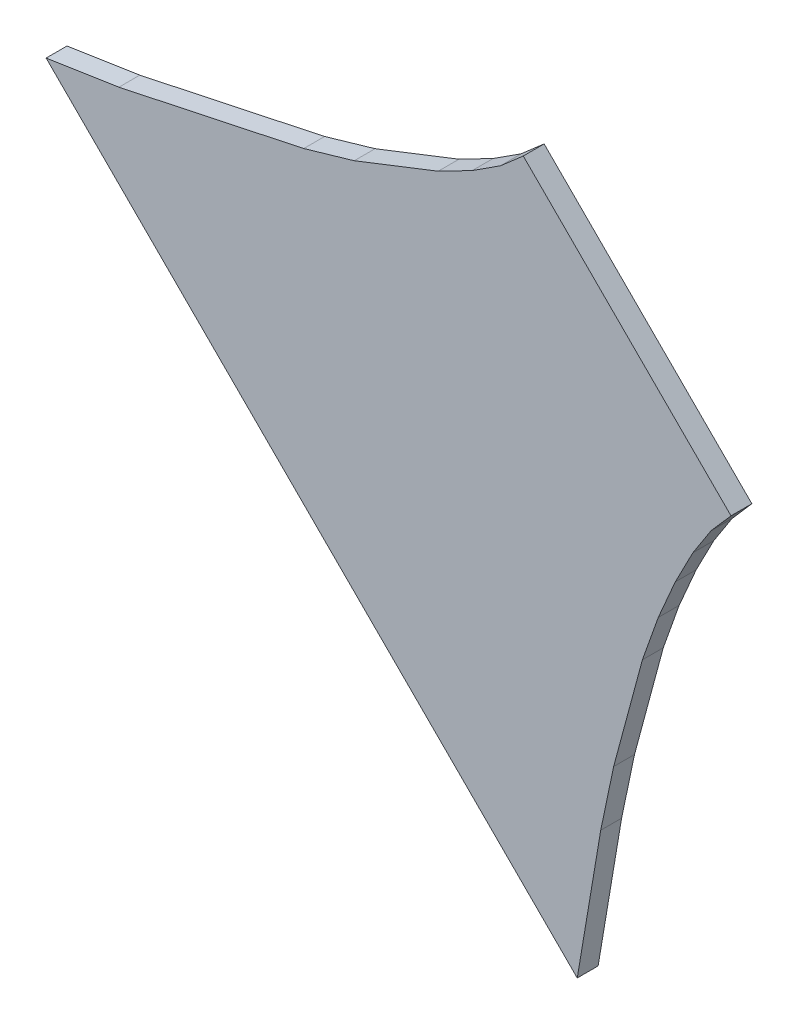
ISO-10303-21;
HEADER;
FILE_DESCRIPTION(('STEP AP214'),'2;1');
FILE_NAME('part.step','',(''),(''),'','','');
FILE_SCHEMA(('AUTOMOTIVE_DESIGN { 1 0 10303 214 1 1 1 1 }'));
ENDSEC;
DATA;
#1=APPLICATION_CONTEXT('core data for automotive mechanical design processes');
#2=APPLICATION_PROTOCOL_DEFINITION('international standard','automotive_design',2000,#1);
#3=PRODUCT_CONTEXT('',#1,'mechanical');
#4=PRODUCT('Part','Part','',(#3));
#5=PRODUCT_RELATED_PRODUCT_CATEGORY('part','',(#4));
#6=PRODUCT_DEFINITION_FORMATION('','',#4);
#7=PRODUCT_DEFINITION_CONTEXT('part definition',#1,'design');
#8=PRODUCT_DEFINITION('design','',#6,#7);
#9=PRODUCT_DEFINITION_SHAPE('','',#8);
#10=(LENGTH_UNIT() NAMED_UNIT(*) SI_UNIT(.MILLI.,.METRE.));
#11=(NAMED_UNIT(*) PLANE_ANGLE_UNIT() SI_UNIT($,.RADIAN.));
#12=(NAMED_UNIT(*) SI_UNIT($,.STERADIAN.) SOLID_ANGLE_UNIT());
#13=UNCERTAINTY_MEASURE_WITH_UNIT(LENGTH_MEASURE(1.E-05),#10,'distance_accuracy_value','');
#14=(GEOMETRIC_REPRESENTATION_CONTEXT(3) GLOBAL_UNCERTAINTY_ASSIGNED_CONTEXT((#13)) GLOBAL_UNIT_ASSIGNED_CONTEXT((#10,
#11,#12)) REPRESENTATION_CONTEXT('',''));
#15=CARTESIAN_POINT('',(0.,0.,0.));
#16=DIRECTION('',(0.,0.,1.));
#17=DIRECTION('',(1.,0.,0.));
#18=AXIS2_PLACEMENT_3D('',#15,#16,#17);
#19=CARTESIAN_POINT('',(111.180000305176,114.353996276855,0.));
#20=DIRECTION('',(0.657083640077483,-0.753817676857292,0.));
#21=DIRECTION('',(-0.753817676857292,-0.657083640077483,0.));
#22=AXIS2_PLACEMENT_3D('',#19,#20,#21);
#23=PLANE('',#22);
#24=DIRECTION('',(-0.753817676857292,-0.657083640077483,0.));
#25=VECTOR('',#24,1.);
#26=CARTESIAN_POINT('',(111.180000305176,114.353996276855,0.03556));
#27=LINE('',#26,#25);
#28=CARTESIAN_POINT('',(111.180000305176,114.353996276855,0.03556));
#29=VERTEX_POINT('',#28);
#30=CARTESIAN_POINT('',(111.140998840332,114.319999694824,0.03556));
#31=VERTEX_POINT('',#30);
#32=EDGE_CURVE('E11',#29,#31,#27,.T.);
#33=ORIENTED_EDGE('',*,*,#32,.F.);
#34=DIRECTION('',(0.,0.,1.));
#35=VECTOR('',#34,1.);
#36=CARTESIAN_POINT('',(111.180000305176,114.353996276855,0.));
#37=LINE('',#36,#35);
#38=CARTESIAN_POINT('',(111.180000305176,114.353996276855,0.));
#39=VERTEX_POINT('',#38);
#40=EDGE_CURVE('E24',#39,#29,#37,.T.);
#41=ORIENTED_EDGE('',*,*,#40,.F.);
#42=DIRECTION('',(-0.753817676857292,-0.657083640077483,0.));
#43=VECTOR('',#42,1.);
#44=CARTESIAN_POINT('',(111.180000305176,114.353996276855,0.));
#45=LINE('',#44,#43);
#46=CARTESIAN_POINT('',(111.140998840332,114.319999694824,0.));
#47=VERTEX_POINT('',#46);
#48=EDGE_CURVE('E154',#39,#47,#45,.T.);
#49=ORIENTED_EDGE('',*,*,#48,.T.);
#50=DIRECTION('',(0.,0.,1.));
#51=VECTOR('',#50,1.);
#52=CARTESIAN_POINT('',(111.140998840332,114.319999694824,0.));
#53=LINE('',#52,#51);
#54=EDGE_CURVE('E37',#47,#31,#53,.T.);
#55=ORIENTED_EDGE('',*,*,#54,.T.);
#56=EDGE_LOOP('',(#33,#41,#49,#55));
#57=FACE_BOUND('',#56,.T.);
#58=ADVANCED_FACE('F17',(#57),#23,.F.);
#59=CARTESIAN_POINT('',(111.140998840332,114.319999694824,0.));
#60=DIRECTION('',(0.54253132067584,-0.840035574297737,0.));
#61=DIRECTION('',(-0.840035574297737,-0.54253132067584,0.));
#62=AXIS2_PLACEMENT_3D('',#59,#60,#61);
#63=PLANE('',#62);
#64=DIRECTION('',(-0.840035574297737,-0.54253132067584,0.));
#65=VECTOR('',#64,1.);
#66=CARTESIAN_POINT('',(111.140998840332,114.319999694824,0.03556));
#67=LINE('',#66,#65);
#68=CARTESIAN_POINT('',(111.093002319336,114.289001464844,0.03556));
#69=VERTEX_POINT('',#68);
#70=EDGE_CURVE('E266',#31,#69,#67,.T.);
#71=ORIENTED_EDGE('',*,*,#70,.F.);
#72=ORIENTED_EDGE('',*,*,#54,.F.);
#73=DIRECTION('',(-0.840035574297737,-0.54253132067584,0.));
#74=VECTOR('',#73,1.);
#75=CARTESIAN_POINT('',(111.140998840332,114.319999694824,0.));
#76=LINE('',#75,#74);
#77=CARTESIAN_POINT('',(111.093002319336,114.289001464844,0.));
#78=VERTEX_POINT('',#77);
#79=EDGE_CURVE('E263',#47,#78,#76,.T.);
#80=ORIENTED_EDGE('',*,*,#79,.T.);
#81=DIRECTION('',(0.,0.,1.));
#82=VECTOR('',#81,1.);
#83=CARTESIAN_POINT('',(111.093002319336,114.289001464844,0.));
#84=LINE('',#83,#82);
#85=EDGE_CURVE('E261',#78,#69,#84,.T.);
#86=ORIENTED_EDGE('',*,*,#85,.T.);
#87=EDGE_LOOP('',(#71,#72,#80,#86));
#88=FACE_BOUND('',#87,.T.);
#89=ADVANCED_FACE('F274',(#88),#63,.F.);
#90=CARTESIAN_POINT('',(111.093002319336,114.289001464844,0.));
#91=DIRECTION('',(0.459416561690511,-0.888220931325348,0.));
#92=DIRECTION('',(-0.888220931325348,-0.459416561690511,0.));
#93=AXIS2_PLACEMENT_3D('',#90,#91,#92);
#94=PLANE('',#93);
#95=DIRECTION('',(-0.888220931325348,-0.459416561690511,0.));
#96=VECTOR('',#95,1.);
#97=CARTESIAN_POINT('',(111.093002319336,114.289001464844,0.03556));
#98=LINE('',#97,#96);
#99=CARTESIAN_POINT('',(111.035003662109,114.259002685547,0.03556));
#100=VERTEX_POINT('',#99);
#101=EDGE_CURVE('E258',#69,#100,#98,.T.);
#102=ORIENTED_EDGE('',*,*,#101,.F.);
#103=ORIENTED_EDGE('',*,*,#85,.F.);
#104=DIRECTION('',(-0.888220931325348,-0.459416561690511,0.));
#105=VECTOR('',#104,1.);
#106=CARTESIAN_POINT('',(111.093002319336,114.289001464844,0.));
#107=LINE('',#106,#105);
#108=CARTESIAN_POINT('',(111.035003662109,114.259002685547,0.));
#109=VERTEX_POINT('',#108);
#110=EDGE_CURVE('E255',#78,#109,#107,.T.);
#111=ORIENTED_EDGE('',*,*,#110,.T.);
#112=DIRECTION('',(0.,0.,1.));
#113=VECTOR('',#112,1.);
#114=CARTESIAN_POINT('',(111.035003662109,114.259002685547,0.));
#115=LINE('',#114,#113);
#116=EDGE_CURVE('E253',#109,#100,#115,.T.);
#117=ORIENTED_EDGE('',*,*,#116,.T.);
#118=EDGE_LOOP('',(#102,#103,#111,#117));
#119=FACE_BOUND('',#118,.T.);
#120=ADVANCED_FACE('F280',(#119),#94,.F.);
#121=CARTESIAN_POINT('',(111.035003662109,114.259002685547,0.));
#122=DIRECTION('',(0.364631599122009,-0.9311518656598,0.));
#123=DIRECTION('',(-0.9311518656598,-0.364631599122009,0.));
#124=AXIS2_PLACEMENT_3D('',#121,#122,#123);
#125=PLANE('',#124);
#126=DIRECTION('',(-0.9311518656598,-0.364631599122009,0.));
#127=VECTOR('',#126,1.);
#128=CARTESIAN_POINT('',(111.035003662109,114.259002685547,0.03556));
#129=LINE('',#128,#127);
#130=CARTESIAN_POINT('',(110.891998291016,114.203002929688,0.03556));
#131=VERTEX_POINT('',#130);
#132=EDGE_CURVE('E250',#100,#131,#129,.T.);
#133=ORIENTED_EDGE('',*,*,#132,.F.);
#134=ORIENTED_EDGE('',*,*,#116,.F.);
#135=DIRECTION('',(-0.9311518656598,-0.364631599122009,0.));
#136=VECTOR('',#135,1.);
#137=CARTESIAN_POINT('',(111.035003662109,114.259002685547,0.));
#138=LINE('',#137,#136);
#139=CARTESIAN_POINT('',(110.891998291016,114.203002929688,0.));
#140=VERTEX_POINT('',#139);
#141=EDGE_CURVE('E247',#109,#140,#138,.T.);
#142=ORIENTED_EDGE('',*,*,#141,.T.);
#143=DIRECTION('',(0.,0.,1.));
#144=VECTOR('',#143,1.);
#145=CARTESIAN_POINT('',(110.891998291016,114.203002929688,0.));
#146=LINE('',#145,#144);
#147=EDGE_CURVE('E245',#140,#131,#146,.T.);
#148=ORIENTED_EDGE('',*,*,#147,.T.);
#149=EDGE_LOOP('',(#133,#134,#142,#148));
#150=FACE_BOUND('',#149,.T.);
#151=ADVANCED_FACE('F282',(#150),#125,.F.);
#152=CARTESIAN_POINT('',(110.891998291016,114.203002929688,0.));
#153=DIRECTION('',(0.279162457207201,-0.960243886981863,0.));
#154=DIRECTION('',(-0.960243886981863,-0.279162457207201,0.));
#155=AXIS2_PLACEMENT_3D('',#152,#153,#154);
#156=PLANE('',#155);
#157=DIRECTION('',(-0.960243886981863,-0.279162457207201,0.));
#158=VECTOR('',#157,1.);
#159=CARTESIAN_POINT('',(110.891998291016,114.203002929688,0.03556));
#160=LINE('',#159,#158);
#161=CARTESIAN_POINT('',(110.805999755859,114.178001403809,0.03556));
#162=VERTEX_POINT('',#161);
#163=EDGE_CURVE('E242',#131,#162,#160,.T.);
#164=ORIENTED_EDGE('',*,*,#163,.F.);
#165=ORIENTED_EDGE('',*,*,#147,.F.);
#166=DIRECTION('',(-0.960243886981863,-0.279162457207201,0.));
#167=VECTOR('',#166,1.);
#168=CARTESIAN_POINT('',(110.891998291016,114.203002929688,0.));
#169=LINE('',#168,#167);
#170=CARTESIAN_POINT('',(110.805999755859,114.178001403809,0.));
#171=VERTEX_POINT('',#170);
#172=EDGE_CURVE('E239',#140,#171,#169,.T.);
#173=ORIENTED_EDGE('',*,*,#172,.T.);
#174=DIRECTION('',(0.,0.,1.));
#175=VECTOR('',#174,1.);
#176=CARTESIAN_POINT('',(110.805999755859,114.178001403809,0.));
#177=LINE('',#176,#175);
#178=EDGE_CURVE('E237',#171,#162,#177,.T.);
#179=ORIENTED_EDGE('',*,*,#178,.T.);
#180=EDGE_LOOP('',(#164,#165,#173,#179));
#181=FACE_BOUND('',#180,.T.);
#182=ADVANCED_FACE('F287',(#181),#156,.F.);
#183=CARTESIAN_POINT('',(110.805999755859,114.178001403809,0.));
#184=DIRECTION('',(0.208046884834278,-0.97811885459322,0.));
#185=DIRECTION('',(-0.97811885459322,-0.208046884834278,0.));
#186=AXIS2_PLACEMENT_3D('',#183,#184,#185);
#187=PLANE('',#186);
#188=DIRECTION('',(-0.97811885459322,-0.208046884834278,0.));
#189=VECTOR('',#188,1.);
#190=CARTESIAN_POINT('',(110.805999755859,114.178001403809,0.03556));
#191=LINE('',#190,#189);
#192=CARTESIAN_POINT('',(110.490997314453,114.111000061035,0.03556));
#193=VERTEX_POINT('',#192);
#194=EDGE_CURVE('E234',#162,#193,#191,.T.);
#195=ORIENTED_EDGE('',*,*,#194,.F.);
#196=ORIENTED_EDGE('',*,*,#178,.F.);
#197=DIRECTION('',(-0.97811885459322,-0.208046884834278,0.));
#198=VECTOR('',#197,1.);
#199=CARTESIAN_POINT('',(110.805999755859,114.178001403809,0.));
#200=LINE('',#199,#198);
#201=CARTESIAN_POINT('',(110.490997314453,114.111000061035,0.));
#202=VERTEX_POINT('',#201);
#203=EDGE_CURVE('E231',#171,#202,#200,.T.);
#204=ORIENTED_EDGE('',*,*,#203,.T.);
#205=DIRECTION('',(0.,0.,1.));
#206=VECTOR('',#205,1.);
#207=CARTESIAN_POINT('',(110.490997314453,114.111000061035,0.));
#208=LINE('',#207,#206);
#209=EDGE_CURVE('E229',#202,#193,#208,.T.);
#210=ORIENTED_EDGE('',*,*,#209,.T.);
#211=EDGE_LOOP('',(#195,#196,#204,#210));
#212=FACE_BOUND('',#211,.T.);
#213=ADVANCED_FACE('F290',(#212),#187,.F.);
#214=CARTESIAN_POINT('',(110.490997314453,114.111000061035,0.));
#215=DIRECTION('',(0.151435620245677,-0.988467122832524,0.));
#216=DIRECTION('',(-0.988467122832524,-0.151435620245677,0.));
#217=AXIS2_PLACEMENT_3D('',#214,#215,#216);
#218=PLANE('',#217);
#219=DIRECTION('',(-0.988467122832524,-0.151435620245677,0.));
#220=VECTOR('',#219,1.);
#221=CARTESIAN_POINT('',(110.490997314453,114.111000061035,0.03556));
#222=LINE('',#221,#220);
#223=CARTESIAN_POINT('',(110.366996765137,114.092002868652,0.03556));
#224=VERTEX_POINT('',#223);
#225=EDGE_CURVE('E226',#193,#224,#222,.T.);
#226=ORIENTED_EDGE('',*,*,#225,.F.);
#227=ORIENTED_EDGE('',*,*,#209,.F.);
#228=DIRECTION('',(-0.988467122832524,-0.151435620245677,0.));
#229=VECTOR('',#228,1.);
#230=CARTESIAN_POINT('',(110.490997314453,114.111000061035,0.));
#231=LINE('',#230,#229);
#232=CARTESIAN_POINT('',(110.366996765137,114.092002868652,0.));
#233=VERTEX_POINT('',#232);
#234=EDGE_CURVE('E223',#202,#233,#231,.T.);
#235=ORIENTED_EDGE('',*,*,#234,.T.);
#236=DIRECTION('',(0.,0.,1.));
#237=VECTOR('',#236,1.);
#238=CARTESIAN_POINT('',(110.366996765137,114.092002868652,0.));
#239=LINE('',#238,#237);
#240=EDGE_CURVE('E221',#233,#224,#239,.T.);
#241=ORIENTED_EDGE('',*,*,#240,.T.);
#242=EDGE_LOOP('',(#226,#227,#235,#241));
#243=FACE_BOUND('',#242,.T.);
#244=ADVANCED_FACE('F295',(#243),#218,.F.);
#245=CARTESIAN_POINT('',(110.366996765137,114.092002868652,0.));
#246=DIRECTION('',(0.707106781186548,0.707106781186548,0.));
#247=DIRECTION('',(0.707106781186548,-0.707106781186548,0.));
#248=AXIS2_PLACEMENT_3D('',#245,#246,#247);
#249=PLANE('',#248);
#250=DIRECTION('',(0.707106781186548,-0.707106781186548,0.));
#251=VECTOR('',#250,1.);
#252=CARTESIAN_POINT('',(110.366996765137,114.092002868652,0.03556));
#253=LINE('',#252,#251);
#254=CARTESIAN_POINT('',(111.272003173828,113.186996459961,0.03556));
#255=VERTEX_POINT('',#254);
#256=EDGE_CURVE('E218',#224,#255,#253,.T.);
#257=ORIENTED_EDGE('',*,*,#256,.F.);
#258=ORIENTED_EDGE('',*,*,#240,.F.);
#259=DIRECTION('',(0.707106781186548,-0.707106781186548,0.));
#260=VECTOR('',#259,1.);
#261=CARTESIAN_POINT('',(110.366996765137,114.092002868652,0.));
#262=LINE('',#261,#260);
#263=CARTESIAN_POINT('',(111.272003173828,113.186996459961,0.));
#264=VERTEX_POINT('',#263);
#265=EDGE_CURVE('E215',#233,#264,#262,.T.);
#266=ORIENTED_EDGE('',*,*,#265,.T.);
#267=DIRECTION('',(0.,0.,1.));
#268=VECTOR('',#267,1.);
#269=CARTESIAN_POINT('',(111.272003173828,113.186996459961,0.));
#270=LINE('',#269,#268);
#271=EDGE_CURVE('E213',#264,#255,#270,.T.);
#272=ORIENTED_EDGE('',*,*,#271,.T.);
#273=EDGE_LOOP('',(#257,#258,#266,#272));
#274=FACE_BOUND('',#273,.T.);
#275=ADVANCED_FACE('F298',(#274),#249,.F.);
#276=CARTESIAN_POINT('',(111.272003173828,113.186996459961,0.));
#277=DIRECTION('',(-0.986174328564868,0.165711175482018,0.));
#278=DIRECTION('',(0.165711175482018,0.986174328564868,0.));
#279=AXIS2_PLACEMENT_3D('',#276,#277,#278);
#280=PLANE('',#279);
#281=DIRECTION('',(0.165711175482018,0.986174328564868,0.));
#282=VECTOR('',#281,1.);
#283=CARTESIAN_POINT('',(111.272003173828,113.186996459961,0.03556));
#284=LINE('',#283,#282);
#285=CARTESIAN_POINT('',(111.311996459961,113.425003051758,0.03556));
#286=VERTEX_POINT('',#285);
#287=EDGE_CURVE('E210',#255,#286,#284,.T.);
#288=ORIENTED_EDGE('',*,*,#287,.F.);
#289=ORIENTED_EDGE('',*,*,#271,.F.);
#290=DIRECTION('',(0.165711175482018,0.986174328564868,0.));
#291=VECTOR('',#290,1.);
#292=CARTESIAN_POINT('',(111.272003173828,113.186996459961,0.));
#293=LINE('',#292,#291);
#294=CARTESIAN_POINT('',(111.311996459961,113.425003051758,0.));
#295=VERTEX_POINT('',#294);
#296=EDGE_CURVE('E207',#264,#295,#293,.T.);
#297=ORIENTED_EDGE('',*,*,#296,.T.);
#298=DIRECTION('',(0.,0.,1.));
#299=VECTOR('',#298,1.);
#300=CARTESIAN_POINT('',(111.311996459961,113.425003051758,0.));
#301=LINE('',#300,#299);
#302=EDGE_CURVE('E205',#295,#286,#301,.T.);
#303=ORIENTED_EDGE('',*,*,#302,.T.);
#304=EDGE_LOOP('',(#288,#289,#297,#303));
#305=FACE_BOUND('',#304,.T.);
#306=ADVANCED_FACE('F303',(#305),#280,.F.);
#307=CARTESIAN_POINT('',(111.311996459961,113.425003051758,0.));
#308=DIRECTION('',(-0.978739521821311,0.205107163270794,0.));
#309=DIRECTION('',(0.205107163270794,0.978739521821311,0.));
#310=AXIS2_PLACEMENT_3D('',#307,#308,#309);
#311=PLANE('',#310);
#312=DIRECTION('',(0.205107163270794,0.978739521821311,0.));
#313=VECTOR('',#312,1.);
#314=CARTESIAN_POINT('',(111.311996459961,113.425003051758,0.03556));
#315=LINE('',#314,#313);
#316=CARTESIAN_POINT('',(111.333999633789,113.529998779297,0.03556));
#317=VERTEX_POINT('',#316);
#318=EDGE_CURVE('E202',#286,#317,#315,.T.);
#319=ORIENTED_EDGE('',*,*,#318,.F.);
#320=ORIENTED_EDGE('',*,*,#302,.F.);
#321=DIRECTION('',(0.205107163270794,0.978739521821311,0.));
#322=VECTOR('',#321,1.);
#323=CARTESIAN_POINT('',(111.311996459961,113.425003051758,0.));
#324=LINE('',#323,#322);
#325=CARTESIAN_POINT('',(111.333999633789,113.529998779297,0.));
#326=VERTEX_POINT('',#325);
#327=EDGE_CURVE('E199',#295,#326,#324,.T.);
#328=ORIENTED_EDGE('',*,*,#327,.T.);
#329=DIRECTION('',(0.,0.,1.));
#330=VECTOR('',#329,1.);
#331=CARTESIAN_POINT('',(111.333999633789,113.529998779297,0.));
#332=LINE('',#331,#330);
#333=EDGE_CURVE('E197',#326,#317,#332,.T.);
#334=ORIENTED_EDGE('',*,*,#333,.T.);
#335=EDGE_LOOP('',(#319,#320,#328,#334));
#336=FACE_BOUND('',#335,.T.);
#337=ADVANCED_FACE('F306',(#336),#311,.F.);
#338=CARTESIAN_POINT('',(111.333999633789,113.529998779297,0.));
#339=DIRECTION('',(-0.965610677607342,0.259992344677089,0.));
#340=DIRECTION('',(0.259992344677089,0.965610677607342,0.));
#341=AXIS2_PLACEMENT_3D('',#338,#339,#340);
#342=PLANE('',#341);
#343=DIRECTION('',(0.259992344677089,0.965610677607342,0.));
#344=VECTOR('',#343,1.);
#345=CARTESIAN_POINT('',(111.333999633789,113.529998779297,0.03556));
#346=LINE('',#345,#344);
#347=CARTESIAN_POINT('',(111.383003234863,113.71199798584,0.03556));
#348=VERTEX_POINT('',#347);
#349=EDGE_CURVE('E194',#317,#348,#346,.T.);
#350=ORIENTED_EDGE('',*,*,#349,.F.);
#351=ORIENTED_EDGE('',*,*,#333,.F.);
#352=DIRECTION('',(0.259992344677089,0.965610677607342,0.));
#353=VECTOR('',#352,1.);
#354=CARTESIAN_POINT('',(111.333999633789,113.529998779297,0.));
#355=LINE('',#354,#353);
#356=CARTESIAN_POINT('',(111.383003234863,113.71199798584,0.));
#357=VERTEX_POINT('',#356);
#358=EDGE_CURVE('E191',#326,#357,#355,.T.);
#359=ORIENTED_EDGE('',*,*,#358,.T.);
#360=DIRECTION('',(0.,0.,1.));
#361=VECTOR('',#360,1.);
#362=CARTESIAN_POINT('',(111.383003234863,113.71199798584,0.));
#363=LINE('',#362,#361);
#364=EDGE_CURVE('E189',#357,#348,#363,.T.);
#365=ORIENTED_EDGE('',*,*,#364,.T.);
#366=EDGE_LOOP('',(#350,#351,#359,#365));
#367=FACE_BOUND('',#366,.T.);
#368=ADVANCED_FACE('F311',(#367),#342,.F.);
#369=CARTESIAN_POINT('',(111.383003234863,113.71199798584,0.));
#370=DIRECTION('',(-0.942305554882744,0.334754001077096,0.));
#371=DIRECTION('',(0.334754001077096,0.942305554882744,0.));
#372=AXIS2_PLACEMENT_3D('',#369,#370,#371);
#373=PLANE('',#372);
#374=DIRECTION('',(0.334754001077096,0.942305554882744,0.));
#375=VECTOR('',#374,1.);
#376=CARTESIAN_POINT('',(111.383003234863,113.71199798584,0.03556));
#377=LINE('',#376,#375);
#378=CARTESIAN_POINT('',(111.410003662109,113.78800201416,0.03556));
#379=VERTEX_POINT('',#378);
#380=EDGE_CURVE('E186',#348,#379,#377,.T.);
#381=ORIENTED_EDGE('',*,*,#380,.F.);
#382=ORIENTED_EDGE('',*,*,#364,.F.);
#383=DIRECTION('',(0.334754001077096,0.942305554882744,0.));
#384=VECTOR('',#383,1.);
#385=CARTESIAN_POINT('',(111.383003234863,113.71199798584,0.));
#386=LINE('',#385,#384);
#387=CARTESIAN_POINT('',(111.410003662109,113.78800201416,0.));
#388=VERTEX_POINT('',#387);
#389=EDGE_CURVE('E183',#357,#388,#386,.T.);
#390=ORIENTED_EDGE('',*,*,#389,.T.);
#391=DIRECTION('',(0.,0.,1.));
#392=VECTOR('',#391,1.);
#393=CARTESIAN_POINT('',(111.410003662109,113.78800201416,0.));
#394=LINE('',#393,#392);
#395=EDGE_CURVE('E181',#388,#379,#394,.T.);
#396=ORIENTED_EDGE('',*,*,#395,.T.);
#397=EDGE_LOOP('',(#381,#382,#390,#396));
#398=FACE_BOUND('',#397,.T.);
#399=ADVANCED_FACE('F314',(#398),#373,.F.);
#400=CARTESIAN_POINT('',(111.410003662109,113.78800201416,0.));
#401=DIRECTION('',(-0.917728371072618,0.397208555960718,0.));
#402=DIRECTION('',(0.397208555960718,0.917728371072618,0.));
#403=AXIS2_PLACEMENT_3D('',#400,#401,#402);
#404=PLANE('',#403);
#405=DIRECTION('',(0.397208555960718,0.917728371072618,0.));
#406=VECTOR('',#405,1.);
#407=CARTESIAN_POINT('',(111.410003662109,113.78800201416,0.03556));
#408=LINE('',#407,#406);
#409=CARTESIAN_POINT('',(111.439002990723,113.855003356934,0.03556));
#410=VERTEX_POINT('',#409);
#411=EDGE_CURVE('E178',#379,#410,#408,.T.);
#412=ORIENTED_EDGE('',*,*,#411,.F.);
#413=ORIENTED_EDGE('',*,*,#395,.F.);
#414=DIRECTION('',(0.397208555960718,0.917728371072618,0.));
#415=VECTOR('',#414,1.);
#416=CARTESIAN_POINT('',(111.410003662109,113.78800201416,0.));
#417=LINE('',#416,#415);
#418=CARTESIAN_POINT('',(111.439002990723,113.855003356934,0.));
#419=VERTEX_POINT('',#418);
#420=EDGE_CURVE('E175',#388,#419,#417,.T.);
#421=ORIENTED_EDGE('',*,*,#420,.T.);
#422=DIRECTION('',(0.,0.,1.));
#423=VECTOR('',#422,1.);
#424=CARTESIAN_POINT('',(111.439002990723,113.855003356934,0.));
#425=LINE('',#424,#423);
#426=EDGE_CURVE('E173',#419,#410,#425,.T.);
#427=ORIENTED_EDGE('',*,*,#426,.T.);
#428=EDGE_LOOP('',(#412,#413,#421,#427));
#429=FACE_BOUND('',#428,.T.);
#430=ADVANCED_FACE('F319',(#429),#404,.F.);
#431=CARTESIAN_POINT('',(111.439002990723,113.855003356934,0.));
#432=DIRECTION('',(-0.888220931325348,0.459416561690511,0.));
#433=DIRECTION('',(0.459416561690511,0.888220931325348,0.));
#434=AXIS2_PLACEMENT_3D('',#431,#432,#433);
#435=PLANE('',#434);
#436=DIRECTION('',(0.459416561690511,0.888220931325348,0.));
#437=VECTOR('',#436,1.);
#438=CARTESIAN_POINT('',(111.439002990723,113.855003356934,0.03556));
#439=LINE('',#438,#437);
#440=CARTESIAN_POINT('',(111.46900177002,113.91300201416,0.03556));
#441=VERTEX_POINT('',#440);
#442=EDGE_CURVE('E170',#410,#441,#439,.T.);
#443=ORIENTED_EDGE('',*,*,#442,.F.);
#444=ORIENTED_EDGE('',*,*,#426,.F.);
#445=DIRECTION('',(0.459416561690511,0.888220931325348,0.));
#446=VECTOR('',#445,1.);
#447=CARTESIAN_POINT('',(111.439002990723,113.855003356934,0.));
#448=LINE('',#447,#446);
#449=CARTESIAN_POINT('',(111.46900177002,113.91300201416,0.));
#450=VERTEX_POINT('',#449);
#451=EDGE_CURVE('E167',#419,#450,#448,.T.);
#452=ORIENTED_EDGE('',*,*,#451,.T.);
#453=DIRECTION('',(0.,0.,1.));
#454=VECTOR('',#453,1.);
#455=CARTESIAN_POINT('',(111.46900177002,113.91300201416,0.));
#456=LINE('',#455,#454);
#457=EDGE_CURVE('E165',#450,#441,#456,.T.);
#458=ORIENTED_EDGE('',*,*,#457,.T.);
#459=EDGE_LOOP('',(#443,#444,#452,#458));
#460=FACE_BOUND('',#459,.T.);
#461=ADVANCED_FACE('F322',(#460),#435,.F.);
#462=CARTESIAN_POINT('',(111.46900177002,113.91300201416,0.));
#463=DIRECTION('',(-0.840035574297737,0.54253132067584,0.));
#464=DIRECTION('',(0.54253132067584,0.840035574297737,0.));
#465=AXIS2_PLACEMENT_3D('',#462,#463,#464);
#466=PLANE('',#465);
#467=DIRECTION('',(0.54253132067584,0.840035574297737,0.));
#468=VECTOR('',#467,1.);
#469=CARTESIAN_POINT('',(111.46900177002,113.91300201416,0.03556));
#470=LINE('',#469,#468);
#471=CARTESIAN_POINT('',(111.5,113.960998535156,0.03556));
#472=VERTEX_POINT('',#471);
#473=EDGE_CURVE('E162',#441,#472,#470,.T.);
#474=ORIENTED_EDGE('',*,*,#473,.F.);
#475=ORIENTED_EDGE('',*,*,#457,.F.);
#476=DIRECTION('',(0.54253132067584,0.840035574297737,0.));
#477=VECTOR('',#476,1.);
#478=CARTESIAN_POINT('',(111.46900177002,113.91300201416,0.));
#479=LINE('',#478,#477);
#480=CARTESIAN_POINT('',(111.5,113.960998535156,0.));
#481=VERTEX_POINT('',#480);
#482=EDGE_CURVE('E160',#450,#481,#479,.T.);
#483=ORIENTED_EDGE('',*,*,#482,.T.);
#484=DIRECTION('',(0.,0.,1.));
#485=VECTOR('',#484,1.);
#486=CARTESIAN_POINT('',(111.5,113.960998535156,0.));
#487=LINE('',#486,#485);
#488=EDGE_CURVE('E145',#481,#472,#487,.T.);
#489=ORIENTED_EDGE('',*,*,#488,.T.);
#490=EDGE_LOOP('',(#474,#475,#483,#489));
#491=FACE_BOUND('',#490,.T.);
#492=ADVANCED_FACE('F325',(#491),#466,.F.);
#493=CARTESIAN_POINT('',(111.5,113.960998535156,0.));
#494=DIRECTION('',(-0.753817676857292,0.657083640077483,0.));
#495=DIRECTION('',(0.657083640077483,0.753817676857292,0.));
#496=AXIS2_PLACEMENT_3D('',#493,#494,#495);
#497=PLANE('',#496);
#498=DIRECTION('',(0.657083640077483,0.753817676857292,0.));
#499=VECTOR('',#498,1.);
#500=CARTESIAN_POINT('',(111.5,113.960998535156,0.03556));
#501=LINE('',#500,#499);
#502=CARTESIAN_POINT('',(111.533996582031,114.,0.03556));
#503=VERTEX_POINT('',#502);
#504=EDGE_CURVE('E149',#472,#503,#501,.T.);
#505=ORIENTED_EDGE('',*,*,#504,.F.);
#506=ORIENTED_EDGE('',*,*,#488,.F.);
#507=DIRECTION('',(0.657083640077483,0.753817676857292,0.));
#508=VECTOR('',#507,1.);
#509=CARTESIAN_POINT('',(111.5,113.960998535156,0.));
#510=LINE('',#509,#508);
#511=CARTESIAN_POINT('',(111.533996582031,114.,0.));
#512=VERTEX_POINT('',#511);
#513=EDGE_CURVE('E141',#481,#512,#510,.T.);
#514=ORIENTED_EDGE('',*,*,#513,.T.);
#515=DIRECTION('',(0.,0.,1.));
#516=VECTOR('',#515,1.);
#517=CARTESIAN_POINT('',(111.533996582031,114.,0.));
#518=LINE('',#517,#516);
#519=EDGE_CURVE('E131',#512,#503,#518,.T.);
#520=ORIENTED_EDGE('',*,*,#519,.T.);
#521=EDGE_LOOP('',(#505,#506,#514,#520));
#522=FACE_BOUND('',#521,.T.);
#523=ADVANCED_FACE('F144',(#522),#497,.F.);
#524=CARTESIAN_POINT('',(111.533996582031,114.,0.));
#525=DIRECTION('',(-0.707106781186548,-0.707106781186548,0.));
#526=DIRECTION('',(-0.707106781186548,0.707106781186548,0.));
#527=AXIS2_PLACEMENT_3D('',#524,#525,#526);
#528=PLANE('',#527);
#529=DIRECTION('',(-0.707106781186548,0.707106781186548,0.));
#530=VECTOR('',#529,1.);
#531=CARTESIAN_POINT('',(111.533996582031,114.,0.03556));
#532=LINE('',#531,#530);
#533=EDGE_CURVE('E137',#503,#29,#532,.T.);
#534=ORIENTED_EDGE('',*,*,#533,.F.);
#535=ORIENTED_EDGE('',*,*,#519,.F.);
#536=DIRECTION('',(-0.707106781186548,0.707106781186548,0.));
#537=VECTOR('',#536,1.);
#538=CARTESIAN_POINT('',(111.533996582031,114.,0.));
#539=LINE('',#538,#537);
#540=EDGE_CURVE('E135',#512,#39,#539,.T.);
#541=ORIENTED_EDGE('',*,*,#540,.T.);
#542=ORIENTED_EDGE('',*,*,#40,.T.);
#543=EDGE_LOOP('',(#534,#535,#541,#542));
#544=FACE_BOUND('',#543,.T.);
#545=ADVANCED_FACE('F133',(#544),#528,.F.);
#546=CARTESIAN_POINT('',(111.180000305176,114.353996276855,0.));
#547=DIRECTION('',(0.,0.,1.));
#548=DIRECTION('',(1.,0.,0.));
#549=AXIS2_PLACEMENT_3D('',#546,#547,#548);
#550=PLANE('',#549);
#551=ORIENTED_EDGE('',*,*,#540,.F.);
#552=ORIENTED_EDGE('',*,*,#513,.F.);
#553=ORIENTED_EDGE('',*,*,#482,.F.);
#554=ORIENTED_EDGE('',*,*,#451,.F.);
#555=ORIENTED_EDGE('',*,*,#420,.F.);
#556=ORIENTED_EDGE('',*,*,#389,.F.);
#557=ORIENTED_EDGE('',*,*,#358,.F.);
#558=ORIENTED_EDGE('',*,*,#327,.F.);
#559=ORIENTED_EDGE('',*,*,#296,.F.);
#560=ORIENTED_EDGE('',*,*,#265,.F.);
#561=ORIENTED_EDGE('',*,*,#234,.F.);
#562=ORIENTED_EDGE('',*,*,#203,.F.);
#563=ORIENTED_EDGE('',*,*,#172,.F.);
#564=ORIENTED_EDGE('',*,*,#141,.F.);
#565=ORIENTED_EDGE('',*,*,#110,.F.);
#566=ORIENTED_EDGE('',*,*,#79,.F.);
#567=ORIENTED_EDGE('',*,*,#48,.F.);
#568=EDGE_LOOP('',(#551,#552,#553,#554,#555,#556,#557,#558,#559,#560,#561,#562,#563,#564,#565,
#566,#567));
#569=FACE_BOUND('',#568,.T.);
#570=ADVANCED_FACE('F152',(#569),#550,.F.);
#571=CARTESIAN_POINT('',(111.180000305176,114.353996276855,0.03556));
#572=DIRECTION('',(0.,0.,1.));
#573=DIRECTION('',(1.,0.,0.));
#574=AXIS2_PLACEMENT_3D('',#571,#572,#573);
#575=PLANE('',#574);
#576=ORIENTED_EDGE('',*,*,#32,.T.);
#577=ORIENTED_EDGE('',*,*,#70,.T.);
#578=ORIENTED_EDGE('',*,*,#101,.T.);
#579=ORIENTED_EDGE('',*,*,#132,.T.);
#580=ORIENTED_EDGE('',*,*,#163,.T.);
#581=ORIENTED_EDGE('',*,*,#194,.T.);
#582=ORIENTED_EDGE('',*,*,#225,.T.);
#583=ORIENTED_EDGE('',*,*,#256,.T.);
#584=ORIENTED_EDGE('',*,*,#287,.T.);
#585=ORIENTED_EDGE('',*,*,#318,.T.);
#586=ORIENTED_EDGE('',*,*,#349,.T.);
#587=ORIENTED_EDGE('',*,*,#380,.T.);
#588=ORIENTED_EDGE('',*,*,#411,.T.);
#589=ORIENTED_EDGE('',*,*,#442,.T.);
#590=ORIENTED_EDGE('',*,*,#473,.T.);
#591=ORIENTED_EDGE('',*,*,#504,.T.);
#592=ORIENTED_EDGE('',*,*,#533,.T.);
#593=EDGE_LOOP('',(#576,#577,#578,#579,#580,#581,#582,#583,#584,#585,#586,#587,#588,#589,#590,
#591,#592));
#594=FACE_BOUND('',#593,.T.);
#595=ADVANCED_FACE('F277',(#594),#575,.T.);
#596=CLOSED_SHELL('',(#58,#89,#120,#151,#182,#213,#244,#275,#306,#337,#368,#399,#430,#461,#492,
#523,#545,#570,#595));
#597=MANIFOLD_SOLID_BREP('B1',#596);
#598=ADVANCED_BREP_SHAPE_REPRESENTATION('',(#18,#597),#14);
#599=SHAPE_DEFINITION_REPRESENTATION(#9,#598);
ENDSEC;
END-ISO-10303-21;
